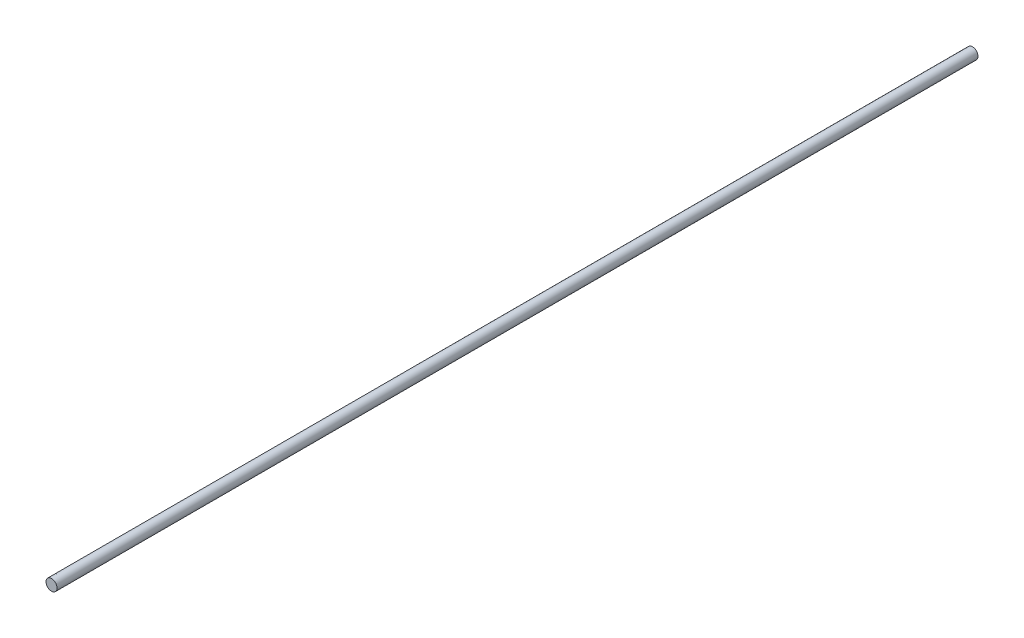
ISO-10303-21;
HEADER;
FILE_DESCRIPTION(('STEP AP214'),'2;1');
FILE_NAME('part.step','',(''),(''),'','','');
FILE_SCHEMA(('AUTOMOTIVE_DESIGN { 1 0 10303 214 1 1 1 1 }'));
ENDSEC;
DATA;
#1=APPLICATION_CONTEXT('core data for automotive mechanical design processes');
#2=APPLICATION_PROTOCOL_DEFINITION('international standard','automotive_design',2000,#1);
#3=PRODUCT_CONTEXT('',#1,'mechanical');
#4=PRODUCT('Part','Part','',(#3));
#5=PRODUCT_RELATED_PRODUCT_CATEGORY('part','',(#4));
#6=PRODUCT_DEFINITION_FORMATION('','',#4);
#7=PRODUCT_DEFINITION_CONTEXT('part definition',#1,'design');
#8=PRODUCT_DEFINITION('design','',#6,#7);
#9=PRODUCT_DEFINITION_SHAPE('','',#8);
#10=(LENGTH_UNIT() NAMED_UNIT(*) SI_UNIT(.MILLI.,.METRE.));
#11=(NAMED_UNIT(*) PLANE_ANGLE_UNIT() SI_UNIT($,.RADIAN.));
#12=(NAMED_UNIT(*) SI_UNIT($,.STERADIAN.) SOLID_ANGLE_UNIT());
#13=UNCERTAINTY_MEASURE_WITH_UNIT(LENGTH_MEASURE(1.E-05),#10,'distance_accuracy_value','');
#14=(GEOMETRIC_REPRESENTATION_CONTEXT(3) GLOBAL_UNCERTAINTY_ASSIGNED_CONTEXT((#13)) GLOBAL_UNIT_ASSIGNED_CONTEXT((#10,
#11,#12)) REPRESENTATION_CONTEXT('',''));
#15=CARTESIAN_POINT('',(0.,0.,0.));
#16=DIRECTION('',(0.,0.,1.));
#17=DIRECTION('',(1.,0.,0.));
#18=AXIS2_PLACEMENT_3D('',#15,#16,#17);
#19=CARTESIAN_POINT('',(0.,0.,500.));
#20=DIRECTION('',(0.,0.,-1.));
#21=DIRECTION('',(-1.,0.,0.));
#22=AXIS2_PLACEMENT_3D('',#19,#20,#21);
#23=CYLINDRICAL_SURFACE('',#22,3.);
#24=CARTESIAN_POINT('',(0.,0.,500.));
#25=DIRECTION('',(0.,0.,1.));
#26=DIRECTION('',(1.,0.,0.));
#27=AXIS2_PLACEMENT_3D('',#24,#25,#26);
#28=CIRCLE('',#27,3.);
#29=CARTESIAN_POINT('',(3.,0.,500.));
#30=VERTEX_POINT('',#29);
#31=EDGE_CURVE('E10',#30,#30,#28,.T.);
#32=ORIENTED_EDGE('',*,*,#31,.F.);
#33=EDGE_LOOP('',(#32));
#34=FACE_BOUND('',#33,.T.);
#35=CARTESIAN_POINT('',(0.,0.,0.));
#36=DIRECTION('',(0.,0.,1.));
#37=DIRECTION('',(1.,0.,0.));
#38=AXIS2_PLACEMENT_3D('',#35,#36,#37);
#39=CIRCLE('',#38,3.);
#40=CARTESIAN_POINT('',(3.,0.,0.));
#41=VERTEX_POINT('',#40);
#42=EDGE_CURVE('E34',#41,#41,#39,.T.);
#43=ORIENTED_EDGE('',*,*,#42,.T.);
#44=EDGE_LOOP('',(#43));
#45=FACE_BOUND('',#44,.T.);
#46=ADVANCED_FACE('F31',(#34,#45),#23,.T.);
#47=CARTESIAN_POINT('',(0.,0.,500.));
#48=DIRECTION('',(0.,0.,1.));
#49=DIRECTION('',(1.,0.,0.));
#50=AXIS2_PLACEMENT_3D('',#47,#48,#49);
#51=PLANE('',#50);
#52=ORIENTED_EDGE('',*,*,#31,.T.);
#53=EDGE_LOOP('',(#52));
#54=FACE_BOUND('',#53,.T.);
#55=ADVANCED_FACE('F46',(#54),#51,.T.);
#56=CARTESIAN_POINT('',(0.,0.,0.));
#57=DIRECTION('',(0.,0.,1.));
#58=DIRECTION('',(1.,0.,0.));
#59=AXIS2_PLACEMENT_3D('',#56,#57,#58);
#60=PLANE('',#59);
#61=ORIENTED_EDGE('',*,*,#42,.F.);
#62=EDGE_LOOP('',(#61));
#63=FACE_BOUND('',#62,.T.);
#64=ADVANCED_FACE('F44',(#63),#60,.F.);
#65=CLOSED_SHELL('',(#46,#55,#64));
#66=MANIFOLD_SOLID_BREP('B2',#65);
#67=ADVANCED_BREP_SHAPE_REPRESENTATION('',(#18,#66),#14);
#68=SHAPE_DEFINITION_REPRESENTATION(#9,#67);
ENDSEC;
END-ISO-10303-21;
